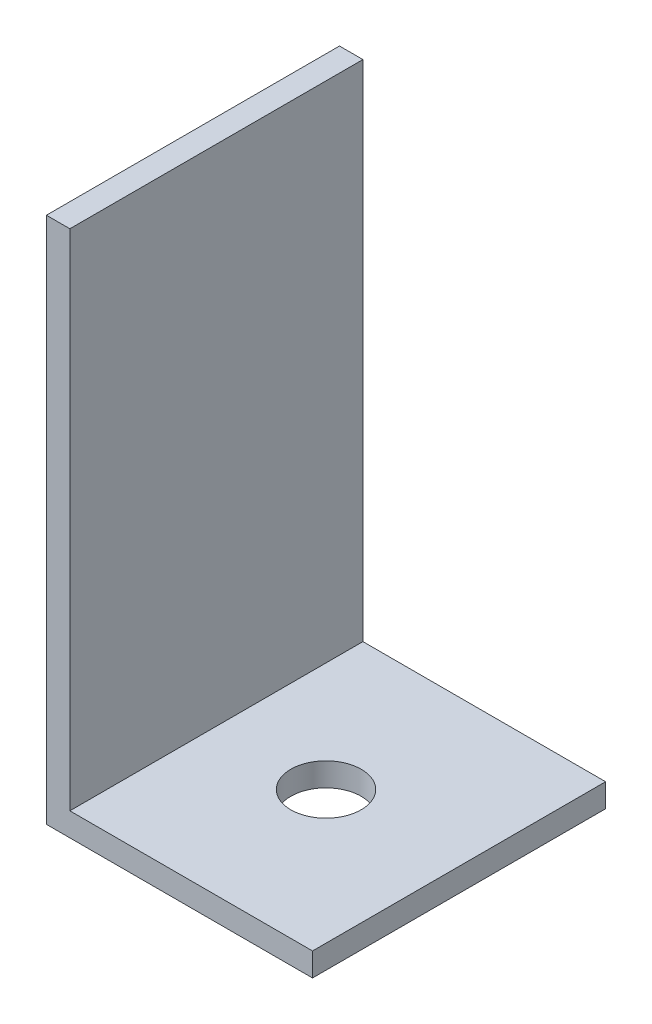
ISO-10303-21;
HEADER;
FILE_DESCRIPTION(('STEP AP214'),'2;1');
FILE_NAME('part.step','',(''),(''),'','','');
FILE_SCHEMA(('AUTOMOTIVE_DESIGN { 1 0 10303 214 1 1 1 1 }'));
ENDSEC;
DATA;
#1=APPLICATION_CONTEXT('core data for automotive mechanical design processes');
#2=APPLICATION_PROTOCOL_DEFINITION('international standard','automotive_design',2000,#1);
#3=PRODUCT_CONTEXT('',#1,'mechanical');
#4=PRODUCT('Part','Part','',(#3));
#5=PRODUCT_RELATED_PRODUCT_CATEGORY('part','',(#4));
#6=PRODUCT_DEFINITION_FORMATION('','',#4);
#7=PRODUCT_DEFINITION_CONTEXT('part definition',#1,'design');
#8=PRODUCT_DEFINITION('design','',#6,#7);
#9=PRODUCT_DEFINITION_SHAPE('','',#8);
#10=(LENGTH_UNIT() NAMED_UNIT(*) SI_UNIT(.MILLI.,.METRE.));
#11=(NAMED_UNIT(*) PLANE_ANGLE_UNIT() SI_UNIT($,.RADIAN.));
#12=(NAMED_UNIT(*) SI_UNIT($,.STERADIAN.) SOLID_ANGLE_UNIT());
#13=UNCERTAINTY_MEASURE_WITH_UNIT(LENGTH_MEASURE(1.E-05),#10,'distance_accuracy_value','');
#14=(GEOMETRIC_REPRESENTATION_CONTEXT(3) GLOBAL_UNCERTAINTY_ASSIGNED_CONTEXT((#13)) GLOBAL_UNIT_ASSIGNED_CONTEXT((#10,
#11,#12)) REPRESENTATION_CONTEXT('',''));
#15=CARTESIAN_POINT('',(0.,0.,0.));
#16=DIRECTION('',(0.,0.,1.));
#17=DIRECTION('',(1.,0.,0.));
#18=AXIS2_PLACEMENT_3D('',#15,#16,#17);
#19=CARTESIAN_POINT('',(0.,2.,0.));
#20=DIRECTION('',(0.,-1.,0.));
#21=DIRECTION('',(0.,0.,-1.));
#22=AXIS2_PLACEMENT_3D('',#19,#20,#21);
#23=PLANE('',#22);
#24=CARTESIAN_POINT('',(0.,2.,0.));
#25=DIRECTION('',(0.,1.,0.));
#26=DIRECTION('',(0.,0.,1.));
#27=AXIS2_PLACEMENT_3D('',#24,#25,#26);
#28=CIRCLE('',#27,3.);
#29=CARTESIAN_POINT('',(0.,2.,3.));
#30=VERTEX_POINT('',#29);
#31=EDGE_CURVE('E110',#30,#30,#28,.T.);
#32=ORIENTED_EDGE('',*,*,#31,.F.);
#33=EDGE_LOOP('',(#32));
#34=FACE_BOUND('',#33,.T.);
#35=DIRECTION('',(0.,0.,-1.));
#36=VECTOR('',#35,1.);
#37=CARTESIAN_POINT('',(-9.35,2.,-12.5));
#38=LINE('',#37,#36);
#39=CARTESIAN_POINT('',(-9.35,2.,12.5));
#40=VERTEX_POINT('',#39);
#41=CARTESIAN_POINT('',(-9.35,2.,-12.5));
#42=VERTEX_POINT('',#41);
#43=EDGE_CURVE('E55',#40,#42,#38,.T.);
#44=ORIENTED_EDGE('',*,*,#43,.F.);
#45=DIRECTION('',(1.,0.,0.));
#46=VECTOR('',#45,1.);
#47=CARTESIAN_POINT('',(11.35,2.,12.5));
#48=LINE('',#47,#46);
#49=CARTESIAN_POINT('',(11.35,2.,12.5));
#50=VERTEX_POINT('',#49);
#51=EDGE_CURVE('E93',#40,#50,#48,.T.);
#52=ORIENTED_EDGE('',*,*,#51,.T.);
#53=DIRECTION('',(0.,0.,-1.));
#54=VECTOR('',#53,1.);
#55=CARTESIAN_POINT('',(11.35,2.,-12.5));
#56=LINE('',#55,#54);
#57=CARTESIAN_POINT('',(11.35,2.,-12.5));
#58=VERTEX_POINT('',#57);
#59=EDGE_CURVE('E61',#50,#58,#56,.T.);
#60=ORIENTED_EDGE('',*,*,#59,.T.);
#61=DIRECTION('',(-1.,0.,0.));
#62=VECTOR('',#61,1.);
#63=CARTESIAN_POINT('',(11.35,2.,-12.5));
#64=LINE('',#63,#62);
#65=EDGE_CURVE('E104',#58,#42,#64,.T.);
#66=ORIENTED_EDGE('',*,*,#65,.T.);
#67=EDGE_LOOP('',(#44,#52,#60,#66));
#68=FACE_BOUND('',#67,.T.);
#69=ADVANCED_FACE('F39',(#34,#68),#23,.F.);
#70=CARTESIAN_POINT('',(0.,0.,0.));
#71=DIRECTION('',(0.,-1.,0.));
#72=DIRECTION('',(0.,0.,-1.));
#73=AXIS2_PLACEMENT_3D('',#70,#71,#72);
#74=PLANE('',#73);
#75=DIRECTION('',(0.,0.,1.));
#76=VECTOR('',#75,1.);
#77=CARTESIAN_POINT('',(-11.35,0.,-12.5));
#78=LINE('',#77,#76);
#79=CARTESIAN_POINT('',(-11.35,0.,-12.5));
#80=VERTEX_POINT('',#79);
#81=CARTESIAN_POINT('',(-11.35,0.,12.5));
#82=VERTEX_POINT('',#81);
#83=EDGE_CURVE('E100',#80,#82,#78,.T.);
#84=ORIENTED_EDGE('',*,*,#83,.F.);
#85=DIRECTION('',(-1.,0.,0.));
#86=VECTOR('',#85,1.);
#87=CARTESIAN_POINT('',(11.35,0.,-12.5));
#88=LINE('',#87,#86);
#89=CARTESIAN_POINT('',(11.35,0.,-12.5));
#90=VERTEX_POINT('',#89);
#91=EDGE_CURVE('E81',#90,#80,#88,.T.);
#92=ORIENTED_EDGE('',*,*,#91,.F.);
#93=DIRECTION('',(0.,0.,-1.));
#94=VECTOR('',#93,1.);
#95=CARTESIAN_POINT('',(11.35,0.,-12.5));
#96=LINE('',#95,#94);
#97=CARTESIAN_POINT('',(11.35,0.,12.5));
#98=VERTEX_POINT('',#97);
#99=EDGE_CURVE('E94',#98,#90,#96,.T.);
#100=ORIENTED_EDGE('',*,*,#99,.F.);
#101=DIRECTION('',(1.,0.,0.));
#102=VECTOR('',#101,1.);
#103=CARTESIAN_POINT('',(11.35,0.,12.5));
#104=LINE('',#103,#102);
#105=EDGE_CURVE('E108',#82,#98,#104,.T.);
#106=ORIENTED_EDGE('',*,*,#105,.F.);
#107=EDGE_LOOP('',(#84,#92,#100,#106));
#108=FACE_BOUND('',#107,.T.);
#109=CARTESIAN_POINT('',(0.,0.,0.));
#110=DIRECTION('',(0.,1.,0.));
#111=DIRECTION('',(0.,0.,1.));
#112=AXIS2_PLACEMENT_3D('',#109,#110,#111);
#113=CIRCLE('',#112,3.);
#114=CARTESIAN_POINT('',(0.,0.,3.));
#115=VERTEX_POINT('',#114);
#116=EDGE_CURVE('E116',#115,#115,#113,.T.);
#117=ORIENTED_EDGE('',*,*,#116,.T.);
#118=EDGE_LOOP('',(#117));
#119=FACE_BOUND('',#118,.T.);
#120=ADVANCED_FACE('F106',(#108,#119),#74,.T.);
#121=CARTESIAN_POINT('',(-11.35,2.,-12.5));
#122=DIRECTION('',(1.,0.,0.));
#123=DIRECTION('',(0.,0.,-1.));
#124=AXIS2_PLACEMENT_3D('',#121,#122,#123);
#125=PLANE('',#124);
#126=ORIENTED_EDGE('',*,*,#83,.T.);
#127=DIRECTION('',(0.,-1.,0.));
#128=VECTOR('',#127,1.);
#129=CARTESIAN_POINT('',(-11.35,2.,12.5));
#130=LINE('',#129,#128);
#131=CARTESIAN_POINT('',(-11.35,45.,12.5));
#132=VERTEX_POINT('',#131);
#133=EDGE_CURVE('E11',#132,#82,#130,.T.);
#134=ORIENTED_EDGE('',*,*,#133,.F.);
#135=DIRECTION('',(0.,0.,1.));
#136=VECTOR('',#135,1.);
#137=CARTESIAN_POINT('',(-11.35,45.,-12.5));
#138=LINE('',#137,#136);
#139=CARTESIAN_POINT('',(-11.35,45.,-12.5));
#140=VERTEX_POINT('',#139);
#141=EDGE_CURVE('E102',#140,#132,#138,.T.);
#142=ORIENTED_EDGE('',*,*,#141,.F.);
#143=DIRECTION('',(0.,-1.,0.));
#144=VECTOR('',#143,1.);
#145=CARTESIAN_POINT('',(-11.35,2.,-12.5));
#146=LINE('',#145,#144);
#147=EDGE_CURVE('E85',#140,#80,#146,.T.);
#148=ORIENTED_EDGE('',*,*,#147,.T.);
#149=EDGE_LOOP('',(#126,#134,#142,#148));
#150=FACE_BOUND('',#149,.T.);
#151=ADVANCED_FACE('F41',(#150),#125,.F.);
#152=CARTESIAN_POINT('',(11.35,2.,12.5));
#153=DIRECTION('',(0.,0.,-1.));
#154=DIRECTION('',(-1.,0.,0.));
#155=AXIS2_PLACEMENT_3D('',#152,#153,#154);
#156=PLANE('',#155);
#157=ORIENTED_EDGE('',*,*,#105,.T.);
#158=DIRECTION('',(0.,-1.,0.));
#159=VECTOR('',#158,1.);
#160=CARTESIAN_POINT('',(11.35,2.,12.5));
#161=LINE('',#160,#159);
#162=EDGE_CURVE('E48',#50,#98,#161,.T.);
#163=ORIENTED_EDGE('',*,*,#162,.F.);
#164=ORIENTED_EDGE('',*,*,#51,.F.);
#165=DIRECTION('',(0.,-1.,0.));
#166=VECTOR('',#165,1.);
#167=CARTESIAN_POINT('',(-9.34999999999999,45.,12.5));
#168=LINE('',#167,#166);
#169=CARTESIAN_POINT('',(-9.34999999999999,45.,12.5));
#170=VERTEX_POINT('',#169);
#171=EDGE_CURVE('E158',#170,#40,#168,.T.);
#172=ORIENTED_EDGE('',*,*,#171,.F.);
#173=DIRECTION('',(1.,0.,0.));
#174=VECTOR('',#173,1.);
#175=CARTESIAN_POINT('',(-11.35,45.,12.5));
#176=LINE('',#175,#174);
#177=EDGE_CURVE('E136',#132,#170,#176,.T.);
#178=ORIENTED_EDGE('',*,*,#177,.F.);
#179=ORIENTED_EDGE('',*,*,#133,.T.);
#180=EDGE_LOOP('',(#157,#163,#164,#172,#178,#179));
#181=FACE_BOUND('',#180,.T.);
#182=ADVANCED_FACE('F130',(#181),#156,.F.);
#183=CARTESIAN_POINT('',(11.35,2.,-12.5));
#184=DIRECTION('',(-1.,0.,0.));
#185=DIRECTION('',(0.,0.,1.));
#186=AXIS2_PLACEMENT_3D('',#183,#184,#185);
#187=PLANE('',#186);
#188=ORIENTED_EDGE('',*,*,#99,.T.);
#189=DIRECTION('',(0.,-1.,0.));
#190=VECTOR('',#189,1.);
#191=CARTESIAN_POINT('',(11.35,2.,-12.5));
#192=LINE('',#191,#190);
#193=EDGE_CURVE('E88',#58,#90,#192,.T.);
#194=ORIENTED_EDGE('',*,*,#193,.F.);
#195=ORIENTED_EDGE('',*,*,#59,.F.);
#196=ORIENTED_EDGE('',*,*,#162,.T.);
#197=EDGE_LOOP('',(#188,#194,#195,#196));
#198=FACE_BOUND('',#197,.T.);
#199=ADVANCED_FACE('F128',(#198),#187,.F.);
#200=CARTESIAN_POINT('',(11.35,2.,-12.5));
#201=DIRECTION('',(0.,0.,1.));
#202=DIRECTION('',(1.,0.,0.));
#203=AXIS2_PLACEMENT_3D('',#200,#201,#202);
#204=PLANE('',#203);
#205=ORIENTED_EDGE('',*,*,#91,.T.);
#206=ORIENTED_EDGE('',*,*,#147,.F.);
#207=DIRECTION('',(-1.,0.,0.));
#208=VECTOR('',#207,1.);
#209=CARTESIAN_POINT('',(-11.35,45.,-12.5));
#210=LINE('',#209,#208);
#211=CARTESIAN_POINT('',(-9.35,45.,-12.5));
#212=VERTEX_POINT('',#211);
#213=EDGE_CURVE('E150',#212,#140,#210,.T.);
#214=ORIENTED_EDGE('',*,*,#213,.F.);
#215=DIRECTION('',(0.,-1.,0.));
#216=VECTOR('',#215,1.);
#217=CARTESIAN_POINT('',(-9.35,45.,-12.5));
#218=LINE('',#217,#216);
#219=EDGE_CURVE('E155',#212,#42,#218,.T.);
#220=ORIENTED_EDGE('',*,*,#219,.T.);
#221=ORIENTED_EDGE('',*,*,#65,.F.);
#222=ORIENTED_EDGE('',*,*,#193,.T.);
#223=EDGE_LOOP('',(#205,#206,#214,#220,#221,#222));
#224=FACE_BOUND('',#223,.T.);
#225=ADVANCED_FACE('F83',(#224),#204,.F.);
#226=CARTESIAN_POINT('',(0.,2.,0.));
#227=DIRECTION('',(0.,-1.,0.));
#228=DIRECTION('',(0.,0.,-1.));
#229=AXIS2_PLACEMENT_3D('',#226,#227,#228);
#230=CYLINDRICAL_SURFACE('',#229,3.);
#231=ORIENTED_EDGE('',*,*,#31,.T.);
#232=EDGE_LOOP('',(#231));
#233=FACE_BOUND('',#232,.T.);
#234=ORIENTED_EDGE('',*,*,#116,.F.);
#235=EDGE_LOOP('',(#234));
#236=FACE_BOUND('',#235,.T.);
#237=ADVANCED_FACE('F183',(#233,#236),#230,.F.);
#238=CARTESIAN_POINT('',(-9.35,45.,-12.5));
#239=DIRECTION('',(-1.,0.,0.));
#240=DIRECTION('',(0.,0.,1.));
#241=AXIS2_PLACEMENT_3D('',#238,#239,#240);
#242=PLANE('',#241);
#243=ORIENTED_EDGE('',*,*,#43,.T.);
#244=ORIENTED_EDGE('',*,*,#219,.F.);
#245=DIRECTION('',(0.,0.,-1.));
#246=VECTOR('',#245,1.);
#247=CARTESIAN_POINT('',(-9.35,45.,-12.5));
#248=LINE('',#247,#246);
#249=EDGE_CURVE('E147',#170,#212,#248,.T.);
#250=ORIENTED_EDGE('',*,*,#249,.F.);
#251=ORIENTED_EDGE('',*,*,#171,.T.);
#252=EDGE_LOOP('',(#243,#244,#250,#251));
#253=FACE_BOUND('',#252,.T.);
#254=ADVANCED_FACE('F156',(#253),#242,.F.);
#255=CARTESIAN_POINT('',(0.,45.,0.));
#256=DIRECTION('',(0.,1.,0.));
#257=DIRECTION('',(0.,0.,1.));
#258=AXIS2_PLACEMENT_3D('',#255,#256,#257);
#259=PLANE('',#258);
#260=ORIENTED_EDGE('',*,*,#141,.T.);
#261=ORIENTED_EDGE('',*,*,#177,.T.);
#262=ORIENTED_EDGE('',*,*,#249,.T.);
#263=ORIENTED_EDGE('',*,*,#213,.T.);
#264=EDGE_LOOP('',(#260,#261,#262,#263));
#265=FACE_BOUND('',#264,.T.);
#266=ADVANCED_FACE('F149',(#265),#259,.T.);
#267=CLOSED_SHELL('',(#69,#120,#151,#182,#199,#225,#237,#254,#266));
#268=MANIFOLD_SOLID_BREP('B2',#267);
#269=ADVANCED_BREP_SHAPE_REPRESENTATION('',(#18,#268),#14);
#270=SHAPE_DEFINITION_REPRESENTATION(#9,#269);
ENDSEC;
END-ISO-10303-21;
